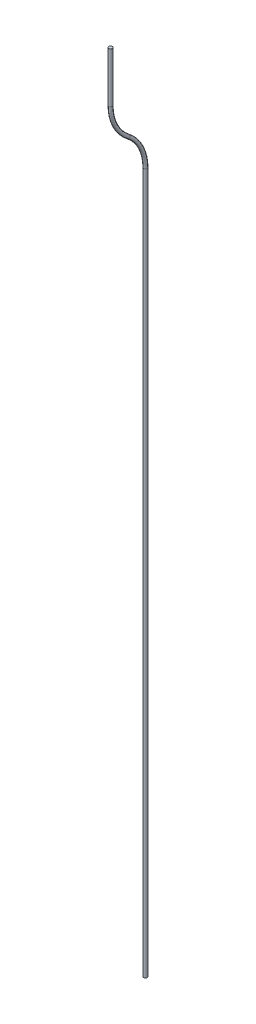
ISO-10303-21;
HEADER;
FILE_DESCRIPTION(('STEP AP214'),'2;1');
FILE_NAME('part.step','',(''),(''),'','','');
FILE_SCHEMA(('AUTOMOTIVE_DESIGN { 1 0 10303 214 1 1 1 1 }'));
ENDSEC;
DATA;
#1=APPLICATION_CONTEXT('core data for automotive mechanical design processes');
#2=APPLICATION_PROTOCOL_DEFINITION('international standard','automotive_design',2000,#1);
#3=PRODUCT_CONTEXT('',#1,'mechanical');
#4=PRODUCT('Part','Part','',(#3));
#5=PRODUCT_RELATED_PRODUCT_CATEGORY('part','',(#4));
#6=PRODUCT_DEFINITION_FORMATION('','',#4);
#7=PRODUCT_DEFINITION_CONTEXT('part definition',#1,'design');
#8=PRODUCT_DEFINITION('design','',#6,#7);
#9=PRODUCT_DEFINITION_SHAPE('','',#8);
#10=(LENGTH_UNIT() NAMED_UNIT(*) SI_UNIT(.MILLI.,.METRE.));
#11=(NAMED_UNIT(*) PLANE_ANGLE_UNIT() SI_UNIT($,.RADIAN.));
#12=(NAMED_UNIT(*) SI_UNIT($,.STERADIAN.) SOLID_ANGLE_UNIT());
#13=UNCERTAINTY_MEASURE_WITH_UNIT(LENGTH_MEASURE(1.E-05),#10,'distance_accuracy_value','');
#14=(GEOMETRIC_REPRESENTATION_CONTEXT(3) GLOBAL_UNCERTAINTY_ASSIGNED_CONTEXT((#13)) GLOBAL_UNIT_ASSIGNED_CONTEXT((#10,
#11,#12)) REPRESENTATION_CONTEXT('',''));
#15=CARTESIAN_POINT('',(0.,0.,0.));
#16=DIRECTION('',(0.,0.,1.));
#17=DIRECTION('',(1.,0.,0.));
#18=AXIS2_PLACEMENT_3D('',#15,#16,#17);
#19=CARTESIAN_POINT('',(0.,0.,16.25));
#20=DIRECTION('',(0.,1.,0.));
#21=DIRECTION('',(0.,0.,1.));
#22=AXIS2_PLACEMENT_3D('',#19,#20,#21);
#23=PLANE('',#22);
#24=CARTESIAN_POINT('',(0.,0.,16.25));
#25=DIRECTION('',(0.,1.,0.));
#26=DIRECTION('',(0.,0.,1.));
#27=AXIS2_PLACEMENT_3D('',#24,#25,#26);
#28=CIRCLE('',#27,0.6);
#29=CARTESIAN_POINT('',(0.,0.,16.85));
#30=VERTEX_POINT('',#29);
#31=EDGE_CURVE('E54',#30,#30,#28,.T.);
#32=ORIENTED_EDGE('',*,*,#31,.T.);
#33=EDGE_LOOP('',(#32));
#34=FACE_BOUND('',#33,.T.);
#35=ADVANCED_FACE('F35',(#34),#23,.T.);
#36=CARTESIAN_POINT('',(0.,-276.9,4.5));
#37=DIRECTION('',(0.,1.,0.));
#38=DIRECTION('',(0.,0.,1.));
#39=AXIS2_PLACEMENT_3D('',#36,#37,#38);
#40=PLANE('',#39);
#41=CARTESIAN_POINT('',(0.,-276.9,4.5));
#42=DIRECTION('',(0.,1.,0.));
#43=DIRECTION('',(0.,0.,1.));
#44=AXIS2_PLACEMENT_3D('',#41,#42,#43);
#45=CIRCLE('',#44,0.6);
#46=CARTESIAN_POINT('',(0.,-276.9,5.1));
#47=VERTEX_POINT('',#46);
#48=EDGE_CURVE('E10',#47,#47,#45,.T.);
#49=ORIENTED_EDGE('',*,*,#48,.F.);
#50=EDGE_LOOP('',(#49));
#51=FACE_BOUND('',#50,.T.);
#52=ADVANCED_FACE('F62',(#51),#40,.F.);
#53=CARTESIAN_POINT('',(0.,0.,16.25));
#54=DIRECTION('',(0.,-1.,0.));
#55=DIRECTION('',(0.,0.,-1.));
#56=AXIS2_PLACEMENT_3D('',#53,#54,#55);
#57=CYLINDRICAL_SURFACE('',#56,0.6);
#58=CARTESIAN_POINT('',(0.,-16.9,16.25));
#59=DIRECTION('',(0.,1.,0.));
#60=DIRECTION('',(0.,0.,1.));
#61=AXIS2_PLACEMENT_3D('',#58,#59,#60);
#62=CIRCLE('',#61,0.6);
#63=CARTESIAN_POINT('',(0.,-16.9,16.85));
#64=VERTEX_POINT('',#63);
#65=EDGE_CURVE('E49',#64,#64,#62,.T.);
#66=ORIENTED_EDGE('',*,*,#65,.T.);
#67=EDGE_LOOP('',(#66));
#68=FACE_BOUND('',#67,.T.);
#69=ORIENTED_EDGE('',*,*,#31,.F.);
#70=EDGE_LOOP('',(#69));
#71=FACE_BOUND('',#70,.T.);
#72=ADVANCED_FACE('F59',(#68,#71),#57,.T.);
#73=CARTESIAN_POINT('',(0.,-16.9,1.05718085106383));
#74=DIRECTION('',(1.,0.,0.));
#75=DIRECTION('',(0.,0.,-1.));
#76=AXIS2_PLACEMENT_3D('',#73,#74,#75);
#77=TOROIDAL_SURFACE('',#76,15.1928191489362,0.6);
#78=CARTESIAN_POINT('',(0.,-28.9,10.375));
#79=DIRECTION('',(0.,0.613304157549235,0.789846827133479));
#80=DIRECTION('',(0.,-0.789846827133479,0.613304157549235));
#81=AXIS2_PLACEMENT_3D('',#78,#79,#80);
#82=CIRCLE('',#81,0.6);
#83=CARTESIAN_POINT('',(0.,-29.3739080962801,10.7429824945295));
#84=VERTEX_POINT('',#83);
#85=EDGE_CURVE('E45',#84,#84,#82,.T.);
#86=CARTESIAN_POINT('',(0.,-16.9,1.05718085106383));
#87=DIRECTION('',(1.,0.,0.));
#88=DIRECTION('',(0.,0.,-1.));
#89=AXIS2_PLACEMENT_3D('',#86,#87,#88);
#90=CIRCLE('',#89,15.7928191489362);
#91=EDGE_CURVE('',#64,#84,#90,.T.);
#92=ORIENTED_EDGE('',*,*,#65,.F.);
#93=ORIENTED_EDGE('',*,*,#85,.T.);
#94=ORIENTED_EDGE('',*,*,#91,.T.);
#95=ORIENTED_EDGE('',*,*,#91,.F.);
#96=EDGE_LOOP('',(#92,#94,#93,#95));
#97=FACE_BOUND('',#96,.T.);
#98=ADVANCED_FACE('F61',(#97),#77,.T.);
#99=CARTESIAN_POINT('',(0.,-40.9,19.6928191489362));
#100=DIRECTION('',(-1.,0.,0.));
#101=DIRECTION('',(0.,0.,1.));
#102=AXIS2_PLACEMENT_3D('',#99,#100,#101);
#103=TOROIDAL_SURFACE('',#102,15.1928191489362,0.6);
#104=CARTESIAN_POINT('',(0.,-40.9,4.5));
#105=DIRECTION('',(0.,1.,0.));
#106=DIRECTION('',(0.,0.,1.));
#107=AXIS2_PLACEMENT_3D('',#104,#105,#106);
#108=CIRCLE('',#107,0.6);
#109=CARTESIAN_POINT('',(0.,-40.9,5.1));
#110=VERTEX_POINT('',#109);
#111=EDGE_CURVE('E41',#110,#110,#108,.T.);
#112=ORIENTED_EDGE('',*,*,#111,.T.);
#113=EDGE_LOOP('',(#112));
#114=FACE_BOUND('',#113,.T.);
#115=ORIENTED_EDGE('',*,*,#85,.F.);
#116=EDGE_LOOP('',(#115));
#117=FACE_BOUND('',#116,.T.);
#118=ADVANCED_FACE('F69',(#114,#117),#103,.T.);
#119=CARTESIAN_POINT('',(0.,-40.9,4.5));
#120=DIRECTION('',(0.,-1.,0.));
#121=DIRECTION('',(0.,0.,-1.));
#122=AXIS2_PLACEMENT_3D('',#119,#120,#121);
#123=CYLINDRICAL_SURFACE('',#122,0.6);
#124=ORIENTED_EDGE('',*,*,#48,.T.);
#125=EDGE_LOOP('',(#124));
#126=FACE_BOUND('',#125,.T.);
#127=ORIENTED_EDGE('',*,*,#111,.F.);
#128=EDGE_LOOP('',(#127));
#129=FACE_BOUND('',#128,.T.);
#130=ADVANCED_FACE('F73',(#126,#129),#123,.T.);
#131=CLOSED_SHELL('',(#35,#52,#72,#98,#118,#130));
#132=MANIFOLD_SOLID_BREP('B2',#131);
#133=ADVANCED_BREP_SHAPE_REPRESENTATION('',(#18,#132),#14);
#134=SHAPE_DEFINITION_REPRESENTATION(#9,#133);
ENDSEC;
END-ISO-10303-21;
